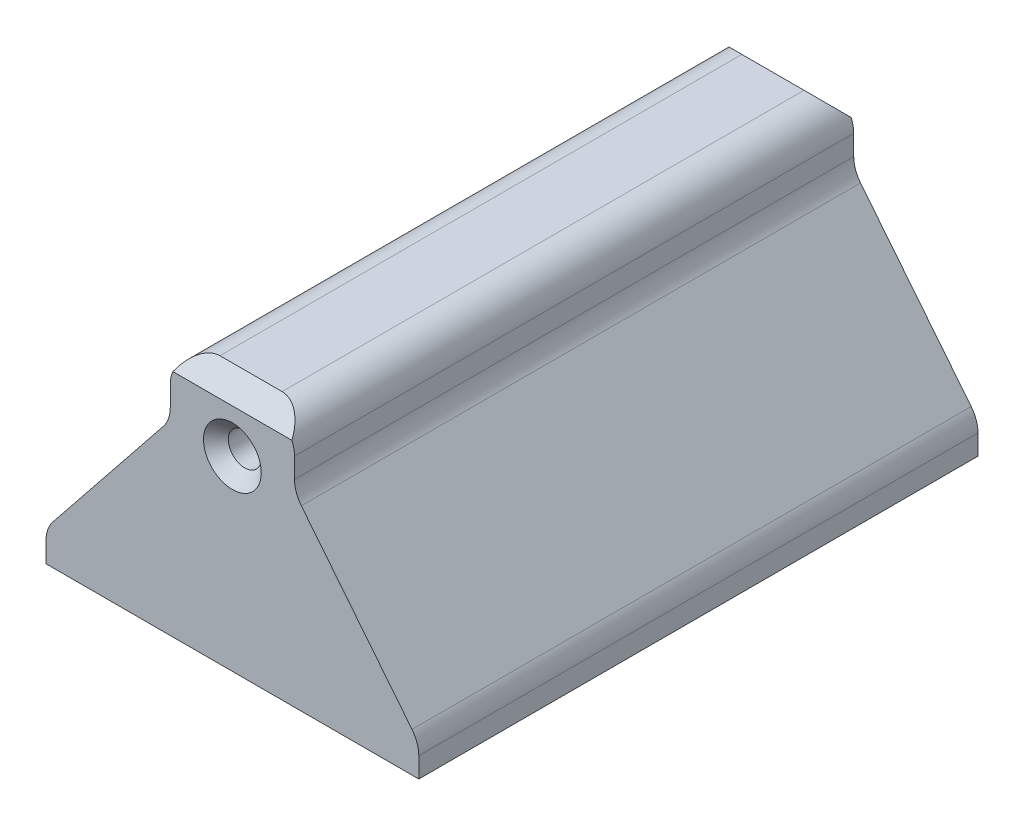
ISO-10303-21;
HEADER;
FILE_DESCRIPTION(('STEP AP214'),'2;1');
FILE_NAME('part.step','',(''),(''),'','','');
FILE_SCHEMA(('AUTOMOTIVE_DESIGN { 1 0 10303 214 1 1 1 1 }'));
ENDSEC;
DATA;
#1=APPLICATION_CONTEXT('core data for automotive mechanical design processes');
#2=APPLICATION_PROTOCOL_DEFINITION('international standard','automotive_design',2000,#1);
#3=PRODUCT_CONTEXT('',#1,'mechanical');
#4=PRODUCT('Part','Part','',(#3));
#5=PRODUCT_RELATED_PRODUCT_CATEGORY('part','',(#4));
#6=PRODUCT_DEFINITION_FORMATION('','',#4);
#7=PRODUCT_DEFINITION_CONTEXT('part definition',#1,'design');
#8=PRODUCT_DEFINITION('design','',#6,#7);
#9=PRODUCT_DEFINITION_SHAPE('','',#8);
#10=(LENGTH_UNIT() NAMED_UNIT(*) SI_UNIT(.MILLI.,.METRE.));
#11=(NAMED_UNIT(*) PLANE_ANGLE_UNIT() SI_UNIT($,.RADIAN.));
#12=(NAMED_UNIT(*) SI_UNIT($,.STERADIAN.) SOLID_ANGLE_UNIT());
#13=UNCERTAINTY_MEASURE_WITH_UNIT(LENGTH_MEASURE(1.E-05),#10,'distance_accuracy_value','');
#14=(GEOMETRIC_REPRESENTATION_CONTEXT(3) GLOBAL_UNCERTAINTY_ASSIGNED_CONTEXT((#13)) GLOBAL_UNIT_ASSIGNED_CONTEXT((#10,
#11,#12)) REPRESENTATION_CONTEXT('',''));
#15=CARTESIAN_POINT('',(0.,0.,0.));
#16=DIRECTION('',(0.,0.,1.));
#17=DIRECTION('',(1.,0.,0.));
#18=AXIS2_PLACEMENT_3D('',#15,#16,#17);
#19=CARTESIAN_POINT('',(25.4,0.,0.));
#20=DIRECTION('',(0.,0.,1.));
#21=DIRECTION('',(0.,-1.,0.));
#22=AXIS2_PLACEMENT_3D('',#19,#20,#21);
#23=PLANE('',#22);
#24=CARTESIAN_POINT('',(12.7,-12.7,0.));
#25=DIRECTION('',(0.,0.,1.));
#26=DIRECTION('',(0.,-1.,0.));
#27=AXIS2_PLACEMENT_3D('',#24,#25,#26);
#28=CIRCLE('',#27,5.90550000000012);
#29=CARTESIAN_POINT('',(12.7,-18.6055000000001,0.));
#30=VERTEX_POINT('',#29);
#31=EDGE_CURVE('E224',#30,#30,#28,.T.);
#32=ORIENTED_EDGE('',*,*,#31,.T.);
#33=EDGE_LOOP('',(#32));
#34=FACE_BOUND('',#33,.T.);
#35=DIRECTION('',(0.,1.,0.));
#36=VECTOR('',#35,1.);
#37=CARTESIAN_POINT('',(-25.4,-50.8,0.));
#38=LINE('',#37,#36);
#39=CARTESIAN_POINT('',(-25.4,-50.8,0.));
#40=VERTEX_POINT('',#39);
#41=CARTESIAN_POINT('',(-25.4,-46.6774597269246,0.));
#42=VERTEX_POINT('',#41);
#43=EDGE_CURVE('E184',#40,#42,#38,.T.);
#44=ORIENTED_EDGE('',*,*,#43,.T.);
#45=CARTESIAN_POINT('',(-19.05,-46.6774597269246,0.));
#46=DIRECTION('',(0.,0.,1.));
#47=DIRECTION('',(0.,-1.,0.));
#48=AXIS2_PLACEMENT_3D('',#45,#46,#47);
#49=CIRCLE('',#48,6.35);
#50=CARTESIAN_POINT('',(-24.0085169399632,-42.7106461749541,0.));
#51=VERTEX_POINT('',#50);
#52=EDGE_CURVE('E245',#42,#51,#49,.F.);
#53=ORIENTED_EDGE('',*,*,#52,.T.);
#54=DIRECTION('',(0.624695047554424,0.78086880944303,0.));
#55=VECTOR('',#54,1.);
#56=CARTESIAN_POINT('',(-25.4,-44.45,0.));
#57=LINE('',#56,#55);
#58=CARTESIAN_POINT('',(-1.39148306003675,-14.4393538250459,0.));
#59=VERTEX_POINT('',#58);
#60=EDGE_CURVE('E185',#51,#59,#57,.T.);
#61=ORIENTED_EDGE('',*,*,#60,.T.);
#62=CARTESIAN_POINT('',(-6.35,-10.4725402730754,0.));
#63=DIRECTION('',(0.,0.,1.));
#64=DIRECTION('',(0.,-1.,0.));
#65=AXIS2_PLACEMENT_3D('',#62,#63,#64);
#66=CIRCLE('',#65,6.35);
#67=CARTESIAN_POINT('',(0.,-10.4725402730754,0.));
#68=VERTEX_POINT('',#67);
#69=EDGE_CURVE('E287',#59,#68,#66,.T.);
#70=ORIENTED_EDGE('',*,*,#69,.T.);
#71=DIRECTION('',(0.,1.,0.));
#72=VECTOR('',#71,1.);
#73=CARTESIAN_POINT('',(0.,0.,0.));
#74=LINE('',#73,#72);
#75=CARTESIAN_POINT('',(0.,-6.35,0.));
#76=VERTEX_POINT('',#75);
#77=EDGE_CURVE('E203',#68,#76,#74,.T.);
#78=ORIENTED_EDGE('',*,*,#77,.T.);
#79=CARTESIAN_POINT('',(6.35,-6.35,0.));
#80=DIRECTION('',(0.,0.,1.));
#81=DIRECTION('',(0.,-1.,0.));
#82=AXIS2_PLACEMENT_3D('',#79,#80,#81);
#83=CIRCLE('',#82,6.35);
#84=CARTESIAN_POINT('',(0.530128867406086,-3.80999999999999,0.));
#85=VERTEX_POINT('',#84);
#86=EDGE_CURVE('E243',#76,#85,#83,.F.);
#87=ORIENTED_EDGE('',*,*,#86,.T.);
#88=DIRECTION('',(1.,0.,0.));
#89=VECTOR('',#88,1.);
#90=CARTESIAN_POINT('',(25.4,-3.80999999999999,0.));
#91=LINE('',#90,#89);
#92=CARTESIAN_POINT('',(24.8698711325939,-3.80999999999999,0.));
#93=VERTEX_POINT('',#92);
#94=EDGE_CURVE('E234',#85,#93,#91,.T.);
#95=ORIENTED_EDGE('',*,*,#94,.T.);
#96=CARTESIAN_POINT('',(19.05,-6.35,0.));
#97=DIRECTION('',(0.,0.,1.));
#98=DIRECTION('',(0.,-1.,0.));
#99=AXIS2_PLACEMENT_3D('',#96,#97,#98);
#100=CIRCLE('',#99,6.35);
#101=CARTESIAN_POINT('',(25.4,-6.35,0.));
#102=VERTEX_POINT('',#101);
#103=EDGE_CURVE('E241',#93,#102,#100,.F.);
#104=ORIENTED_EDGE('',*,*,#103,.T.);
#105=DIRECTION('',(0.,1.,0.));
#106=VECTOR('',#105,1.);
#107=CARTESIAN_POINT('',(25.4,0.,0.));
#108=LINE('',#107,#106);
#109=CARTESIAN_POINT('',(25.4,-10.4725402730754,0.));
#110=VERTEX_POINT('',#109);
#111=EDGE_CURVE('E204',#110,#102,#108,.T.);
#112=ORIENTED_EDGE('',*,*,#111,.F.);
#113=CARTESIAN_POINT('',(31.75,-10.4725402730754,0.));
#114=DIRECTION('',(0.,0.,1.));
#115=DIRECTION('',(0.,-1.,0.));
#116=AXIS2_PLACEMENT_3D('',#113,#114,#115);
#117=CIRCLE('',#116,6.35);
#118=CARTESIAN_POINT('',(26.7914830600368,-14.4393538250459,0.));
#119=VERTEX_POINT('',#118);
#120=EDGE_CURVE('E50',#110,#119,#117,.T.);
#121=ORIENTED_EDGE('',*,*,#120,.T.);
#122=DIRECTION('',(0.624695047554424,-0.78086880944303,0.));
#123=VECTOR('',#122,1.);
#124=CARTESIAN_POINT('',(50.8,-44.45,0.));
#125=LINE('',#124,#123);
#126=CARTESIAN_POINT('',(49.4085169399632,-42.7106461749541,0.));
#127=VERTEX_POINT('',#126);
#128=EDGE_CURVE('E191',#119,#127,#125,.T.);
#129=ORIENTED_EDGE('',*,*,#128,.T.);
#130=CARTESIAN_POINT('',(44.45,-46.6774597269246,0.));
#131=DIRECTION('',(0.,0.,1.));
#132=DIRECTION('',(0.,-1.,0.));
#133=AXIS2_PLACEMENT_3D('',#130,#131,#132);
#134=CIRCLE('',#133,6.35);
#135=CARTESIAN_POINT('',(50.8,-46.6774597269246,0.));
#136=VERTEX_POINT('',#135);
#137=EDGE_CURVE('E239',#127,#136,#134,.F.);
#138=ORIENTED_EDGE('',*,*,#137,.T.);
#139=DIRECTION('',(0.,-1.,0.));
#140=VECTOR('',#139,1.);
#141=CARTESIAN_POINT('',(50.8,-50.8,0.));
#142=LINE('',#141,#140);
#143=CARTESIAN_POINT('',(50.8,-50.8,0.));
#144=VERTEX_POINT('',#143);
#145=EDGE_CURVE('E198',#136,#144,#142,.T.);
#146=ORIENTED_EDGE('',*,*,#145,.T.);
#147=DIRECTION('',(-1.,0.,0.));
#148=VECTOR('',#147,1.);
#149=CARTESIAN_POINT('',(25.4,-50.8,0.));
#150=LINE('',#149,#148);
#151=EDGE_CURVE('E180',#144,#40,#150,.T.);
#152=ORIENTED_EDGE('',*,*,#151,.T.);
#153=EDGE_LOOP('',(#44,#53,#61,#70,#78,#87,#95,#104,#112,#121,#129,#138,#146,#152));
#154=FACE_BOUND('',#153,.T.);
#155=ADVANCED_FACE('F42',(#34,#154),#23,.F.);
#156=CARTESIAN_POINT('',(25.4,0.,0.));
#157=DIRECTION('',(0.,-1.,0.));
#158=DIRECTION('',(0.,0.,-1.));
#159=AXIS2_PLACEMENT_3D('',#156,#157,#158);
#160=PLANE('',#159);
#161=DIRECTION('',(-1.,0.,0.));
#162=VECTOR('',#161,1.);
#163=CARTESIAN_POINT('',(25.4,0.,3.80999999999998));
#164=LINE('',#163,#162);
#165=CARTESIAN_POINT('',(19.05,0.,3.80999999999998));
#166=VERTEX_POINT('',#165);
#167=CARTESIAN_POINT('',(6.35,0.,3.80999999999998));
#168=VERTEX_POINT('',#167);
#169=EDGE_CURVE('E230',#166,#168,#164,.T.);
#170=ORIENTED_EDGE('',*,*,#169,.T.);
#171=DIRECTION('',(0.,0.,1.));
#172=VECTOR('',#171,1.);
#173=CARTESIAN_POINT('',(6.35,0.,110.49));
#174=LINE('',#173,#172);
#175=CARTESIAN_POINT('',(6.35,0.,110.49));
#176=VERTEX_POINT('',#175);
#177=EDGE_CURVE('E264',#168,#176,#174,.T.);
#178=ORIENTED_EDGE('',*,*,#177,.T.);
#179=DIRECTION('',(1.,0.,0.));
#180=VECTOR('',#179,1.);
#181=CARTESIAN_POINT('',(25.4,0.,110.49));
#182=LINE('',#181,#180);
#183=CARTESIAN_POINT('',(19.05,0.,110.49));
#184=VERTEX_POINT('',#183);
#185=EDGE_CURVE('E232',#176,#184,#182,.T.);
#186=ORIENTED_EDGE('',*,*,#185,.T.);
#187=DIRECTION('',(0.,0.,1.));
#188=VECTOR('',#187,1.);
#189=CARTESIAN_POINT('',(19.05,0.,0.));
#190=LINE('',#189,#188);
#191=EDGE_CURVE('E64',#184,#166,#190,.F.);
#192=ORIENTED_EDGE('',*,*,#191,.T.);
#193=EDGE_LOOP('',(#170,#178,#186,#192));
#194=FACE_BOUND('',#193,.T.);
#195=ADVANCED_FACE('F320',(#194),#160,.F.);
#196=CARTESIAN_POINT('',(25.4,0.,114.3));
#197=DIRECTION('',(0.,0.,-1.));
#198=DIRECTION('',(0.,1.,0.));
#199=AXIS2_PLACEMENT_3D('',#196,#197,#198);
#200=PLANE('',#199);
#201=CARTESIAN_POINT('',(12.7,-12.7,114.3));
#202=DIRECTION('',(0.,0.,-1.));
#203=DIRECTION('',(0.,1.,0.));
#204=AXIS2_PLACEMENT_3D('',#201,#202,#203);
#205=CIRCLE('',#204,5.90549999999994);
#206=CARTESIAN_POINT('',(12.7,-6.79450000000007,114.3));
#207=VERTEX_POINT('',#206);
#208=EDGE_CURVE('E179',#207,#207,#205,.T.);
#209=ORIENTED_EDGE('',*,*,#208,.T.);
#210=EDGE_LOOP('',(#209));
#211=FACE_BOUND('',#210,.T.);
#212=DIRECTION('',(-0.624695047554424,-0.78086880944303,0.));
#213=VECTOR('',#212,1.);
#214=CARTESIAN_POINT('',(-25.4,-44.45,114.3));
#215=LINE('',#214,#213);
#216=CARTESIAN_POINT('',(-1.39148306003676,-14.439353825046,114.3));
#217=VERTEX_POINT('',#216);
#218=CARTESIAN_POINT('',(-24.0085169399632,-42.7106461749541,114.3));
#219=VERTEX_POINT('',#218);
#220=EDGE_CURVE('E168',#217,#219,#215,.T.);
#221=ORIENTED_EDGE('',*,*,#220,.T.);
#222=CARTESIAN_POINT('',(-19.05,-46.6774597269247,114.3));
#223=DIRECTION('',(0.,0.,-1.));
#224=DIRECTION('',(0.,1.,0.));
#225=AXIS2_PLACEMENT_3D('',#222,#223,#224);
#226=CIRCLE('',#225,6.35);
#227=CARTESIAN_POINT('',(-25.4,-46.6774597269247,114.3));
#228=VERTEX_POINT('',#227);
#229=EDGE_CURVE('E163',#219,#228,#226,.F.);
#230=ORIENTED_EDGE('',*,*,#229,.T.);
#231=DIRECTION('',(0.,-1.,0.));
#232=VECTOR('',#231,1.);
#233=CARTESIAN_POINT('',(-25.4,-50.8,114.3));
#234=LINE('',#233,#232);
#235=CARTESIAN_POINT('',(-25.4,-50.8,114.3));
#236=VERTEX_POINT('',#235);
#237=EDGE_CURVE('E155',#228,#236,#234,.T.);
#238=ORIENTED_EDGE('',*,*,#237,.T.);
#239=DIRECTION('',(-1.,0.,0.));
#240=VECTOR('',#239,1.);
#241=CARTESIAN_POINT('',(25.4,-50.8,114.3));
#242=LINE('',#241,#240);
#243=CARTESIAN_POINT('',(50.8,-50.8,114.3));
#244=VERTEX_POINT('',#243);
#245=EDGE_CURVE('E160',#244,#236,#242,.T.);
#246=ORIENTED_EDGE('',*,*,#245,.F.);
#247=DIRECTION('',(0.,1.,0.));
#248=VECTOR('',#247,1.);
#249=CARTESIAN_POINT('',(50.8,-50.8,114.3));
#250=LINE('',#249,#248);
#251=CARTESIAN_POINT('',(50.8,-46.6774597269247,114.3));
#252=VERTEX_POINT('',#251);
#253=EDGE_CURVE('E193',#244,#252,#250,.T.);
#254=ORIENTED_EDGE('',*,*,#253,.T.);
#255=CARTESIAN_POINT('',(44.45,-46.6774597269247,114.3));
#256=DIRECTION('',(0.,0.,-1.));
#257=DIRECTION('',(0.,1.,0.));
#258=AXIS2_PLACEMENT_3D('',#255,#256,#257);
#259=CIRCLE('',#258,6.35);
#260=CARTESIAN_POINT('',(49.4085169399632,-42.7106461749541,114.3));
#261=VERTEX_POINT('',#260);
#262=EDGE_CURVE('E252',#252,#261,#259,.F.);
#263=ORIENTED_EDGE('',*,*,#262,.T.);
#264=DIRECTION('',(-0.624695047554424,0.78086880944303,0.));
#265=VECTOR('',#264,1.);
#266=CARTESIAN_POINT('',(50.8,-44.45,114.3));
#267=LINE('',#266,#265);
#268=CARTESIAN_POINT('',(26.7914830600367,-14.439353825046,114.3));
#269=VERTEX_POINT('',#268);
#270=EDGE_CURVE('E195',#261,#269,#267,.T.);
#271=ORIENTED_EDGE('',*,*,#270,.T.);
#272=CARTESIAN_POINT('',(31.75,-10.4725402730754,114.3));
#273=DIRECTION('',(0.,0.,-1.));
#274=DIRECTION('',(0.,1.,0.));
#275=AXIS2_PLACEMENT_3D('',#272,#273,#274);
#276=CIRCLE('',#275,6.35);
#277=CARTESIAN_POINT('',(25.4,-10.4725402730754,114.3));
#278=VERTEX_POINT('',#277);
#279=EDGE_CURVE('E11',#269,#278,#276,.T.);
#280=ORIENTED_EDGE('',*,*,#279,.T.);
#281=DIRECTION('',(0.,-1.,0.));
#282=VECTOR('',#281,1.);
#283=CARTESIAN_POINT('',(25.4,0.,114.3));
#284=LINE('',#283,#282);
#285=CARTESIAN_POINT('',(25.4,-6.35000000000001,114.3));
#286=VERTEX_POINT('',#285);
#287=EDGE_CURVE('E207',#286,#278,#284,.T.);
#288=ORIENTED_EDGE('',*,*,#287,.F.);
#289=CARTESIAN_POINT('',(19.05,-6.35000000000001,114.3));
#290=DIRECTION('',(0.,0.,-1.));
#291=DIRECTION('',(0.,1.,0.));
#292=AXIS2_PLACEMENT_3D('',#289,#290,#291);
#293=CIRCLE('',#292,6.35);
#294=CARTESIAN_POINT('',(24.8698711325939,-3.81000000000001,114.3));
#295=VERTEX_POINT('',#294);
#296=EDGE_CURVE('E254',#286,#295,#293,.F.);
#297=ORIENTED_EDGE('',*,*,#296,.T.);
#298=DIRECTION('',(-1.,0.,0.));
#299=VECTOR('',#298,1.);
#300=CARTESIAN_POINT('',(25.4,-3.81000000000001,114.3));
#301=LINE('',#300,#299);
#302=CARTESIAN_POINT('',(0.530128867406087,-3.81000000000001,114.3));
#303=VERTEX_POINT('',#302);
#304=EDGE_CURVE('E227',#295,#303,#301,.T.);
#305=ORIENTED_EDGE('',*,*,#304,.T.);
#306=CARTESIAN_POINT('',(6.35,-6.35000000000001,114.3));
#307=DIRECTION('',(0.,0.,-1.));
#308=DIRECTION('',(0.,1.,0.));
#309=AXIS2_PLACEMENT_3D('',#306,#307,#308);
#310=CIRCLE('',#309,6.35);
#311=CARTESIAN_POINT('',(0.,-6.35000000000001,114.3));
#312=VERTEX_POINT('',#311);
#313=EDGE_CURVE('E256',#303,#312,#310,.F.);
#314=ORIENTED_EDGE('',*,*,#313,.T.);
#315=DIRECTION('',(0.,-1.,0.));
#316=VECTOR('',#315,1.);
#317=CARTESIAN_POINT('',(0.,0.,114.3));
#318=LINE('',#317,#316);
#319=CARTESIAN_POINT('',(0.,-10.4725402730754,114.3));
#320=VERTEX_POINT('',#319);
#321=EDGE_CURVE('E208',#312,#320,#318,.T.);
#322=ORIENTED_EDGE('',*,*,#321,.T.);
#323=CARTESIAN_POINT('',(-6.35,-10.4725402730754,114.3));
#324=DIRECTION('',(0.,0.,-1.));
#325=DIRECTION('',(0.,1.,0.));
#326=AXIS2_PLACEMENT_3D('',#323,#324,#325);
#327=CIRCLE('',#326,6.35);
#328=EDGE_CURVE('E289',#320,#217,#327,.T.);
#329=ORIENTED_EDGE('',*,*,#328,.T.);
#330=EDGE_LOOP('',(#221,#230,#238,#246,#254,#263,#271,#280,#288,#297,#305,#314,#322,#329));
#331=FACE_BOUND('',#330,.T.);
#332=ADVANCED_FACE('F158',(#211,#331),#200,.F.);
#333=CARTESIAN_POINT('',(25.4,-50.8,0.));
#334=DIRECTION('',(0.,1.,0.));
#335=DIRECTION('',(0.,0.,1.));
#336=AXIS2_PLACEMENT_3D('',#333,#334,#335);
#337=PLANE('',#336);
#338=ORIENTED_EDGE('',*,*,#245,.T.);
#339=DIRECTION('',(0.,0.,-1.));
#340=VECTOR('',#339,1.);
#341=CARTESIAN_POINT('',(-25.4,-50.8,160.090501198393));
#342=LINE('',#341,#340);
#343=EDGE_CURVE('E175',#236,#40,#342,.T.);
#344=ORIENTED_EDGE('',*,*,#343,.T.);
#345=ORIENTED_EDGE('',*,*,#151,.F.);
#346=DIRECTION('',(0.,0.,-1.));
#347=VECTOR('',#346,1.);
#348=CARTESIAN_POINT('',(50.8,-50.8,160.090501198393));
#349=LINE('',#348,#347);
#350=EDGE_CURVE('E178',#244,#144,#349,.T.);
#351=ORIENTED_EDGE('',*,*,#350,.F.);
#352=EDGE_LOOP('',(#338,#344,#345,#351));
#353=FACE_BOUND('',#352,.T.);
#354=ADVANCED_FACE('F173',(#353),#337,.F.);
#355=CARTESIAN_POINT('',(25.4,0.,0.));
#356=DIRECTION('',(-1.,0.,0.));
#357=DIRECTION('',(0.,0.,1.));
#358=AXIS2_PLACEMENT_3D('',#355,#356,#357);
#359=PLANE('',#358);
#360=ORIENTED_EDGE('',*,*,#111,.T.);
#361=DIRECTION('',(0.,0.,1.));
#362=VECTOR('',#361,1.);
#363=CARTESIAN_POINT('',(25.4,-6.35,0.));
#364=LINE('',#363,#362);
#365=EDGE_CURVE('E277',#102,#286,#364,.T.);
#366=ORIENTED_EDGE('',*,*,#365,.T.);
#367=ORIENTED_EDGE('',*,*,#287,.T.);
#368=DIRECTION('',(0.,0.,-1.));
#369=VECTOR('',#368,1.);
#370=CARTESIAN_POINT('',(25.4,-10.4725402730754,0.));
#371=LINE('',#370,#369);
#372=EDGE_CURVE('E274',#278,#110,#371,.T.);
#373=ORIENTED_EDGE('',*,*,#372,.T.);
#374=EDGE_LOOP('',(#360,#366,#367,#373));
#375=FACE_BOUND('',#374,.T.);
#376=ADVANCED_FACE('F303',(#375),#359,.F.);
#377=CARTESIAN_POINT('',(0.,0.,0.));
#378=DIRECTION('',(-1.,0.,0.));
#379=DIRECTION('',(0.,0.,1.));
#380=AXIS2_PLACEMENT_3D('',#377,#378,#379);
#381=PLANE('',#380);
#382=ORIENTED_EDGE('',*,*,#77,.F.);
#383=DIRECTION('',(0.,0.,-1.));
#384=VECTOR('',#383,1.);
#385=CARTESIAN_POINT('',(0.,-10.4725402730754,114.3));
#386=LINE('',#385,#384);
#387=EDGE_CURVE('E261',#68,#320,#386,.F.);
#388=ORIENTED_EDGE('',*,*,#387,.T.);
#389=ORIENTED_EDGE('',*,*,#321,.F.);
#390=DIRECTION('',(0.,0.,1.));
#391=VECTOR('',#390,1.);
#392=CARTESIAN_POINT('',(0.,-6.35,3.80999999999998));
#393=LINE('',#392,#391);
#394=EDGE_CURVE('E259',#312,#76,#393,.F.);
#395=ORIENTED_EDGE('',*,*,#394,.T.);
#396=EDGE_LOOP('',(#382,#388,#389,#395));
#397=FACE_BOUND('',#396,.T.);
#398=ADVANCED_FACE('F325',(#397),#381,.T.);
#399=CARTESIAN_POINT('',(12.7,-12.7,114.3));
#400=DIRECTION('',(0.,0.,-1.));
#401=DIRECTION('',(0.,1.,0.));
#402=AXIS2_PLACEMENT_3D('',#399,#400,#401);
#403=CYLINDRICAL_SURFACE('',#402,3.3655);
#404=CARTESIAN_POINT('',(12.7,-12.7,111.76));
#405=DIRECTION('',(0.,0.,-1.));
#406=DIRECTION('',(-1.,0.,0.));
#407=AXIS2_PLACEMENT_3D('',#404,#405,#406);
#408=CIRCLE('',#407,3.3655);
#409=CARTESIAN_POINT('',(12.7,-9.33450000000001,111.76));
#410=VERTEX_POINT('',#409);
#411=EDGE_CURVE('E221',#410,#410,#408,.F.);
#412=CARTESIAN_POINT('',(12.7,-12.7,2.5400000000001));
#413=DIRECTION('',(0.,0.,1.));
#414=DIRECTION('',(1.,0.,0.));
#415=AXIS2_PLACEMENT_3D('',#412,#413,#414);
#416=CIRCLE('',#415,3.3655);
#417=CARTESIAN_POINT('',(12.7,-9.3345,2.54000000000008));
#418=VERTEX_POINT('',#417);
#419=EDGE_CURVE('E218',#418,#418,#416,.F.);
#420=CARTESIAN_POINT('',(12.7,-9.33450000000001,111.76));
#421=CARTESIAN_POINT('',(12.7,-9.33450000000001,110.622291666667));
#422=CARTESIAN_POINT('',(12.7,-9.33450000000001,109.484583333333));
#423=CARTESIAN_POINT('',(12.7,-9.33450000000001,107.209166666667));
#424=CARTESIAN_POINT('',(12.7,-9.33450000000001,106.071458333333));
#425=CARTESIAN_POINT('',(12.7,-9.33450000000001,103.796041666667));
#426=CARTESIAN_POINT('',(12.7,-9.33450000000001,102.658333333333));
#427=CARTESIAN_POINT('',(12.7,-9.33450000000001,100.382916666667));
#428=CARTESIAN_POINT('',(12.7,-9.33450000000001,99.2452083333334));
#429=CARTESIAN_POINT('',(12.7,-9.33450000000001,96.9697916666667));
#430=CARTESIAN_POINT('',(12.7,-9.33450000000001,95.8320833333334));
#431=CARTESIAN_POINT('',(12.7,-9.33450000000001,93.5566666666667));
#432=CARTESIAN_POINT('',(12.7,-9.33450000000001,92.4189583333334));
#433=CARTESIAN_POINT('',(12.7,-9.33450000000001,90.1435416666667));
#434=CARTESIAN_POINT('',(12.7,-9.33450000000001,89.0058333333334));
#435=CARTESIAN_POINT('',(12.7,-9.33450000000001,86.7304166666667));
#436=CARTESIAN_POINT('',(12.7,-9.33450000000001,85.5927083333334));
#437=CARTESIAN_POINT('',(12.7,-9.33450000000001,83.3172916666667));
#438=CARTESIAN_POINT('',(12.7,-9.33450000000001,82.1795833333334));
#439=CARTESIAN_POINT('',(12.7,-9.33450000000001,79.9041666666667));
#440=CARTESIAN_POINT('',(12.7,-9.33450000000001,78.7664583333334));
#441=CARTESIAN_POINT('',(12.7,-9.33450000000001,76.4910416666667));
#442=CARTESIAN_POINT('',(12.7,-9.33450000000001,75.3533333333334));
#443=CARTESIAN_POINT('',(12.7,-9.33450000000001,73.0779166666667));
#444=CARTESIAN_POINT('',(12.7,-9.33450000000001,71.9402083333334));
#445=CARTESIAN_POINT('',(12.7,-9.33450000000001,69.6647916666667));
#446=CARTESIAN_POINT('',(12.7,-9.33450000000001,68.5270833333334));
#447=CARTESIAN_POINT('',(12.7,-9.33450000000001,66.2516666666667));
#448=CARTESIAN_POINT('',(12.7,-9.33450000000001,65.1139583333334));
#449=CARTESIAN_POINT('',(12.7,-9.33450000000001,62.8385416666667));
#450=CARTESIAN_POINT('',(12.7,-9.33450000000001,61.7008333333334));
#451=CARTESIAN_POINT('',(12.7,-9.33450000000001,59.4254166666667));
#452=CARTESIAN_POINT('',(12.7,-9.33450000000001,58.2877083333334));
#453=CARTESIAN_POINT('',(12.7,-9.33450000000001,56.0122916666667));
#454=CARTESIAN_POINT('',(12.7,-9.33450000000001,54.8745833333334));
#455=CARTESIAN_POINT('',(12.7,-9.33450000000001,52.5991666666667));
#456=CARTESIAN_POINT('',(12.7,-9.3345,51.4614583333334));
#457=CARTESIAN_POINT('',(12.7,-9.3345,49.1860416666667));
#458=CARTESIAN_POINT('',(12.7,-9.3345,48.0483333333334));
#459=CARTESIAN_POINT('',(12.7,-9.3345,45.7729166666668));
#460=CARTESIAN_POINT('',(12.7,-9.3345,44.6352083333334));
#461=CARTESIAN_POINT('',(12.7,-9.3345,42.3597916666668));
#462=CARTESIAN_POINT('',(12.7,-9.3345,41.2220833333334));
#463=CARTESIAN_POINT('',(12.7,-9.3345,38.9466666666668));
#464=CARTESIAN_POINT('',(12.7,-9.3345,37.8089583333334));
#465=CARTESIAN_POINT('',(12.7,-9.3345,35.5335416666668));
#466=CARTESIAN_POINT('',(12.7,-9.3345,34.3958333333334));
#467=CARTESIAN_POINT('',(12.7,-9.3345,32.1204166666668));
#468=CARTESIAN_POINT('',(12.7,-9.3345,30.9827083333334));
#469=CARTESIAN_POINT('',(12.7,-9.3345,28.7072916666667));
#470=CARTESIAN_POINT('',(12.7,-9.3345,27.5695833333334));
#471=CARTESIAN_POINT('',(12.7,-9.3345,25.2941666666668));
#472=CARTESIAN_POINT('',(12.7,-9.3345,24.1564583333334));
#473=CARTESIAN_POINT('',(12.7,-9.3345,21.8810416666667));
#474=CARTESIAN_POINT('',(12.7,-9.3345,20.7433333333334));
#475=CARTESIAN_POINT('',(12.7,-9.3345,18.4679166666668));
#476=CARTESIAN_POINT('',(12.7,-9.3345,17.3302083333334));
#477=CARTESIAN_POINT('',(12.7,-9.3345,15.0547916666668));
#478=CARTESIAN_POINT('',(12.7,-9.3345,13.9170833333334));
#479=CARTESIAN_POINT('',(12.7,-9.3345,11.6416666666667));
#480=CARTESIAN_POINT('',(12.7,-9.3345,10.5039583333334));
#481=CARTESIAN_POINT('',(12.7,-9.3345,8.22854166666676));
#482=CARTESIAN_POINT('',(12.7,-9.3345,7.09083333333343));
#483=CARTESIAN_POINT('',(12.7,-9.3345,4.81541666666676));
#484=CARTESIAN_POINT('',(12.7,-9.3345,3.67770833333342));
#485=CARTESIAN_POINT('',(12.7,-9.3345,2.54000000000008));
#486=B_SPLINE_CURVE_WITH_KNOTS('',3,(#420,#421,#422,#423,#424,#425,#426,#427,#428,#429,#430,
#431,#432,#433,#434,#435,#436,#437,#438,#439,#440,#441,#442,#443,#444,#445,#446,#447,#448,#449,
#450,#451,#452,#453,#454,#455,#456,#457,#458,#459,#460,#461,#462,#463,#464,#465,#466,#467,#468,
#469,#470,#471,#472,#473,#474,#475,#476,#477,#478,#479,#480,#481,#482,#483,#484,#485),
.UNSPECIFIED.,.F.,.F.,(4,2,2,2,2,2,2,2,2,2,2,2,2,2,2,2,2,2,2,2,2,2,2,2,2,2,2,2,2,2,2,2,4),(0.,
3.413125,6.82625000000001,10.239375,13.6525,17.065625,20.47875,23.891875,27.305,30.718125,
34.13125,37.544375,40.9575,44.370625,47.78375,51.196875,54.61,58.023125,61.43625,64.849375,
68.2625,71.675625,75.08875,78.501875,81.915,85.328125,88.74125,92.154375,95.5675,98.980625,
102.39375,105.806875,109.22),.UNSPECIFIED.);
#487=EDGE_CURVE('BSEAM363',#410,#418,#486,.T.);
#488=ORIENTED_EDGE('',*,*,#411,.T.);
#489=ORIENTED_EDGE('',*,*,#419,.T.);
#490=ORIENTED_EDGE('',*,*,#487,.T.);
#491=ORIENTED_EDGE('',*,*,#487,.F.);
#492=EDGE_LOOP('',(#488,#490,#489,#491));
#493=FACE_BOUND('',#492,.T.);
#494=ADVANCED_FACE('F363',(#493),#403,.F.);
#495=CARTESIAN_POINT('',(12.7,-12.7,114.3));
#496=DIRECTION('',(0.,0.,1.));
#497=DIRECTION('',(1.,0.,0.));
#498=AXIS2_PLACEMENT_3D('',#495,#496,#497);
#499=CONICAL_SURFACE('',#498,5.90549999999994,0.785398163397447);
#500=ORIENTED_EDGE('',*,*,#411,.F.);
#501=EDGE_LOOP('',(#500));
#502=FACE_BOUND('',#501,.T.);
#503=ORIENTED_EDGE('',*,*,#208,.F.);
#504=EDGE_LOOP('',(#503));
#505=FACE_BOUND('',#504,.T.);
#506=ADVANCED_FACE('F356',(#502,#505),#499,.F.);
#507=CARTESIAN_POINT('',(12.7,-12.7,2.5400000000001));
#508=DIRECTION('',(0.,0.,-1.));
#509=DIRECTION('',(-1.,0.,0.));
#510=AXIS2_PLACEMENT_3D('',#507,#508,#509);
#511=CONICAL_SURFACE('',#510,3.3655,0.785398163397452);
#512=ORIENTED_EDGE('',*,*,#31,.F.);
#513=EDGE_LOOP('',(#512));
#514=FACE_BOUND('',#513,.T.);
#515=ORIENTED_EDGE('',*,*,#419,.F.);
#516=EDGE_LOOP('',(#515));
#517=FACE_BOUND('',#516,.T.);
#518=ADVANCED_FACE('F362',(#514,#517),#511,.F.);
#519=CARTESIAN_POINT('',(50.8,-50.8,160.090501198393));
#520=DIRECTION('',(1.,0.,0.));
#521=DIRECTION('',(0.,0.,-1.));
#522=AXIS2_PLACEMENT_3D('',#519,#520,#521);
#523=PLANE('',#522);
#524=ORIENTED_EDGE('',*,*,#145,.F.);
#525=DIRECTION('',(0.,0.,-1.));
#526=VECTOR('',#525,1.);
#527=CARTESIAN_POINT('',(50.8,-46.6774597269247,160.090501198393));
#528=LINE('',#527,#526);
#529=EDGE_CURVE('E285',#136,#252,#528,.F.);
#530=ORIENTED_EDGE('',*,*,#529,.T.);
#531=ORIENTED_EDGE('',*,*,#253,.F.);
#532=ORIENTED_EDGE('',*,*,#350,.T.);
#533=EDGE_LOOP('',(#524,#530,#531,#532));
#534=FACE_BOUND('',#533,.T.);
#535=ADVANCED_FACE('F370',(#534),#523,.T.);
#536=CARTESIAN_POINT('',(50.8,-44.45,160.090501198393));
#537=DIRECTION('',(0.78086880944303,0.624695047554424,0.));
#538=DIRECTION('',(-0.624695047554424,0.78086880944303,0.));
#539=AXIS2_PLACEMENT_3D('',#536,#537,#538);
#540=PLANE('',#539);
#541=ORIENTED_EDGE('',*,*,#270,.F.);
#542=DIRECTION('',(0.,0.,-1.));
#543=VECTOR('',#542,1.);
#544=CARTESIAN_POINT('',(49.4085169399632,-42.7106461749541,160.090501198393));
#545=LINE('',#544,#543);
#546=EDGE_CURVE('E282',#261,#127,#545,.T.);
#547=ORIENTED_EDGE('',*,*,#546,.T.);
#548=ORIENTED_EDGE('',*,*,#128,.F.);
#549=DIRECTION('',(0.,0.,-1.));
#550=VECTOR('',#549,1.);
#551=CARTESIAN_POINT('',(26.7914830600368,-14.439353825046,160.090501198393));
#552=LINE('',#551,#550);
#553=EDGE_CURVE('E280',#119,#269,#552,.F.);
#554=ORIENTED_EDGE('',*,*,#553,.T.);
#555=EDGE_LOOP('',(#541,#547,#548,#554));
#556=FACE_BOUND('',#555,.T.);
#557=ADVANCED_FACE('F298',(#556),#540,.T.);
#558=CARTESIAN_POINT('',(-25.4,-44.45,160.090501198393));
#559=DIRECTION('',(-0.78086880944303,0.624695047554424,0.));
#560=DIRECTION('',(-0.624695047554424,-0.78086880944303,0.));
#561=AXIS2_PLACEMENT_3D('',#558,#559,#560);
#562=PLANE('',#561);
#563=ORIENTED_EDGE('',*,*,#60,.F.);
#564=DIRECTION('',(0.,0.,-1.));
#565=VECTOR('',#564,1.);
#566=CARTESIAN_POINT('',(-24.0085169399632,-42.7106461749541,160.090501198393));
#567=LINE('',#566,#565);
#568=EDGE_CURVE('E250',#51,#219,#567,.F.);
#569=ORIENTED_EDGE('',*,*,#568,.T.);
#570=ORIENTED_EDGE('',*,*,#220,.F.);
#571=DIRECTION('',(0.,0.,-1.));
#572=VECTOR('',#571,1.);
#573=CARTESIAN_POINT('',(-1.39148306003676,-14.4393538250459,0.));
#574=LINE('',#573,#572);
#575=EDGE_CURVE('E247',#217,#59,#574,.T.);
#576=ORIENTED_EDGE('',*,*,#575,.T.);
#577=EDGE_LOOP('',(#563,#569,#570,#576));
#578=FACE_BOUND('',#577,.T.);
#579=ADVANCED_FACE('F334',(#578),#562,.T.);
#580=CARTESIAN_POINT('',(-25.4,-50.8,160.090501198393));
#581=DIRECTION('',(-1.,0.,0.));
#582=DIRECTION('',(0.,0.,1.));
#583=AXIS2_PLACEMENT_3D('',#580,#581,#582);
#584=PLANE('',#583);
#585=ORIENTED_EDGE('',*,*,#237,.F.);
#586=DIRECTION('',(0.,0.,-1.));
#587=VECTOR('',#586,1.);
#588=CARTESIAN_POINT('',(-25.4,-46.6774597269247,160.090501198393));
#589=LINE('',#588,#587);
#590=EDGE_CURVE('E237',#228,#42,#589,.T.);
#591=ORIENTED_EDGE('',*,*,#590,.T.);
#592=ORIENTED_EDGE('',*,*,#43,.F.);
#593=ORIENTED_EDGE('',*,*,#343,.F.);
#594=EDGE_LOOP('',(#585,#591,#592,#593));
#595=FACE_BOUND('',#594,.T.);
#596=ADVANCED_FACE('F182',(#595),#584,.T.);
#597=CARTESIAN_POINT('',(25.4,-3.81000000000001,114.3));
#598=DIRECTION('',(0.,-0.70710678118655,-0.707106781186545));
#599=DIRECTION('',(-1.,0.,0.));
#600=AXIS2_PLACEMENT_3D('',#597,#598,#599);
#601=PLANE('',#600);
#602=ORIENTED_EDGE('',*,*,#185,.F.);
#603=CARTESIAN_POINT('',(6.35,-6.35000000000001,116.84));
#604=DIRECTION('',(0.,-0.70710678118655,-0.707106781186545));
#605=DIRECTION('',(0.,0.707106781186545,-0.70710678118655));
#606=AXIS2_PLACEMENT_3D('',#603,#604,#605);
#607=ELLIPSE('',#606,8.98025612106919,6.35);
#608=EDGE_CURVE('E269',#176,#303,#607,.F.);
#609=ORIENTED_EDGE('',*,*,#608,.T.);
#610=ORIENTED_EDGE('',*,*,#304,.F.);
#611=CARTESIAN_POINT('',(19.05,-6.35000000000001,116.84));
#612=DIRECTION('',(0.,-0.70710678118655,-0.707106781186545));
#613=DIRECTION('',(0.,-0.707106781186545,0.70710678118655));
#614=AXIS2_PLACEMENT_3D('',#611,#612,#613);
#615=ELLIPSE('',#614,8.98025612106919,6.35);
#616=EDGE_CURVE('E267',#295,#184,#615,.F.);
#617=ORIENTED_EDGE('',*,*,#616,.T.);
#618=EDGE_LOOP('',(#602,#609,#610,#617));
#619=FACE_BOUND('',#618,.T.);
#620=ADVANCED_FACE('F314',(#619),#601,.F.);
#621=CARTESIAN_POINT('',(25.4,0.,3.80999999999998));
#622=DIRECTION('',(0.,-0.707106781186546,0.707106781186549));
#623=DIRECTION('',(-1.,0.,0.));
#624=AXIS2_PLACEMENT_3D('',#621,#622,#623);
#625=PLANE('',#624);
#626=ORIENTED_EDGE('',*,*,#94,.F.);
#627=CARTESIAN_POINT('',(6.35,-6.35,-2.54));
#628=DIRECTION('',(0.,-0.707106781186546,0.707106781186549));
#629=DIRECTION('',(0.,-0.707106781186549,-0.707106781186546));
#630=AXIS2_PLACEMENT_3D('',#627,#628,#629);
#631=ELLIPSE('',#630,8.98025612106914,6.35);
#632=EDGE_CURVE('E57',#85,#168,#631,.F.);
#633=ORIENTED_EDGE('',*,*,#632,.T.);
#634=ORIENTED_EDGE('',*,*,#169,.F.);
#635=CARTESIAN_POINT('',(19.05,-6.35,-2.54));
#636=DIRECTION('',(0.,-0.707106781186546,0.707106781186549));
#637=DIRECTION('',(0.,0.707106781186549,0.707106781186546));
#638=AXIS2_PLACEMENT_3D('',#635,#636,#637);
#639=ELLIPSE('',#638,8.98025612106914,6.35);
#640=EDGE_CURVE('E271',#166,#93,#639,.F.);
#641=ORIENTED_EDGE('',*,*,#640,.T.);
#642=EDGE_LOOP('',(#626,#633,#634,#641));
#643=FACE_BOUND('',#642,.T.);
#644=ADVANCED_FACE('F321',(#643),#625,.F.);
#645=CARTESIAN_POINT('',(-19.05,-46.6774597269247,160.090501198393));
#646=DIRECTION('',(0.,0.,-1.));
#647=DIRECTION('',(0.,1.,0.));
#648=AXIS2_PLACEMENT_3D('',#645,#646,#647);
#649=CYLINDRICAL_SURFACE('',#648,6.35);
#650=ORIENTED_EDGE('',*,*,#229,.F.);
#651=ORIENTED_EDGE('',*,*,#568,.F.);
#652=ORIENTED_EDGE('',*,*,#52,.F.);
#653=ORIENTED_EDGE('',*,*,#590,.F.);
#654=EDGE_LOOP('',(#650,#651,#652,#653));
#655=FACE_BOUND('',#654,.T.);
#656=ADVANCED_FACE('F337',(#655),#649,.T.);
#657=CARTESIAN_POINT('',(-6.35,-10.4725402730754,160.090501198393));
#658=DIRECTION('',(0.,0.,1.));
#659=DIRECTION('',(0.,-1.,0.));
#660=AXIS2_PLACEMENT_3D('',#657,#658,#659);
#661=CYLINDRICAL_SURFACE('',#660,6.35);
#662=ORIENTED_EDGE('',*,*,#328,.F.);
#663=ORIENTED_EDGE('',*,*,#387,.F.);
#664=ORIENTED_EDGE('',*,*,#69,.F.);
#665=ORIENTED_EDGE('',*,*,#575,.F.);
#666=EDGE_LOOP('',(#662,#663,#664,#665));
#667=FACE_BOUND('',#666,.T.);
#668=ADVANCED_FACE('F331',(#667),#661,.F.);
#669=CARTESIAN_POINT('',(6.35,-6.35,0.));
#670=DIRECTION('',(0.,0.,-1.));
#671=DIRECTION('',(0.,1.,0.));
#672=AXIS2_PLACEMENT_3D('',#669,#670,#671);
#673=CYLINDRICAL_SURFACE('',#672,6.35);
#674=ORIENTED_EDGE('',*,*,#86,.F.);
#675=ORIENTED_EDGE('',*,*,#394,.F.);
#676=ORIENTED_EDGE('',*,*,#313,.F.);
#677=ORIENTED_EDGE('',*,*,#608,.F.);
#678=ORIENTED_EDGE('',*,*,#177,.F.);
#679=ORIENTED_EDGE('',*,*,#632,.F.);
#680=EDGE_LOOP('',(#674,#675,#676,#677,#678,#679));
#681=FACE_BOUND('',#680,.T.);
#682=ADVANCED_FACE('F318',(#681),#673,.T.);
#683=CARTESIAN_POINT('',(19.05,-6.35,0.));
#684=DIRECTION('',(0.,0.,1.));
#685=DIRECTION('',(0.,-1.,0.));
#686=AXIS2_PLACEMENT_3D('',#683,#684,#685);
#687=CYLINDRICAL_SURFACE('',#686,6.35);
#688=ORIENTED_EDGE('',*,*,#640,.F.);
#689=ORIENTED_EDGE('',*,*,#191,.F.);
#690=ORIENTED_EDGE('',*,*,#616,.F.);
#691=ORIENTED_EDGE('',*,*,#296,.F.);
#692=ORIENTED_EDGE('',*,*,#365,.F.);
#693=ORIENTED_EDGE('',*,*,#103,.F.);
#694=EDGE_LOOP('',(#688,#689,#690,#691,#692,#693));
#695=FACE_BOUND('',#694,.T.);
#696=ADVANCED_FACE('F308',(#695),#687,.T.);
#697=CARTESIAN_POINT('',(44.45,-46.6774597269247,160.090501198393));
#698=DIRECTION('',(0.,0.,-1.));
#699=DIRECTION('',(0.,1.,0.));
#700=AXIS2_PLACEMENT_3D('',#697,#698,#699);
#701=CYLINDRICAL_SURFACE('',#700,6.35);
#702=ORIENTED_EDGE('',*,*,#262,.F.);
#703=ORIENTED_EDGE('',*,*,#529,.F.);
#704=ORIENTED_EDGE('',*,*,#137,.F.);
#705=ORIENTED_EDGE('',*,*,#546,.F.);
#706=EDGE_LOOP('',(#702,#703,#704,#705));
#707=FACE_BOUND('',#706,.T.);
#708=ADVANCED_FACE('F485',(#707),#701,.T.);
#709=CARTESIAN_POINT('',(31.75,-10.4725402730754,0.));
#710=DIRECTION('',(0.,0.,-1.));
#711=DIRECTION('',(0.,1.,0.));
#712=AXIS2_PLACEMENT_3D('',#709,#710,#711);
#713=CYLINDRICAL_SURFACE('',#712,6.35);
#714=ORIENTED_EDGE('',*,*,#279,.F.);
#715=ORIENTED_EDGE('',*,*,#553,.F.);
#716=ORIENTED_EDGE('',*,*,#120,.F.);
#717=ORIENTED_EDGE('',*,*,#372,.F.);
#718=EDGE_LOOP('',(#714,#715,#716,#717));
#719=FACE_BOUND('',#718,.T.);
#720=ADVANCED_FACE('F44',(#719),#713,.F.);
#721=CLOSED_SHELL('',(#155,#195,#332,#354,#376,#398,#494,#506,#518,#535,#557,#579,#596,#620,
#644,#656,#668,#682,#696,#708,#720));
#722=MANIFOLD_SOLID_BREP('B2',#721);
#723=ADVANCED_BREP_SHAPE_REPRESENTATION('',(#18,#722),#14);
#724=SHAPE_DEFINITION_REPRESENTATION(#9,#723);
ENDSEC;
END-ISO-10303-21;
